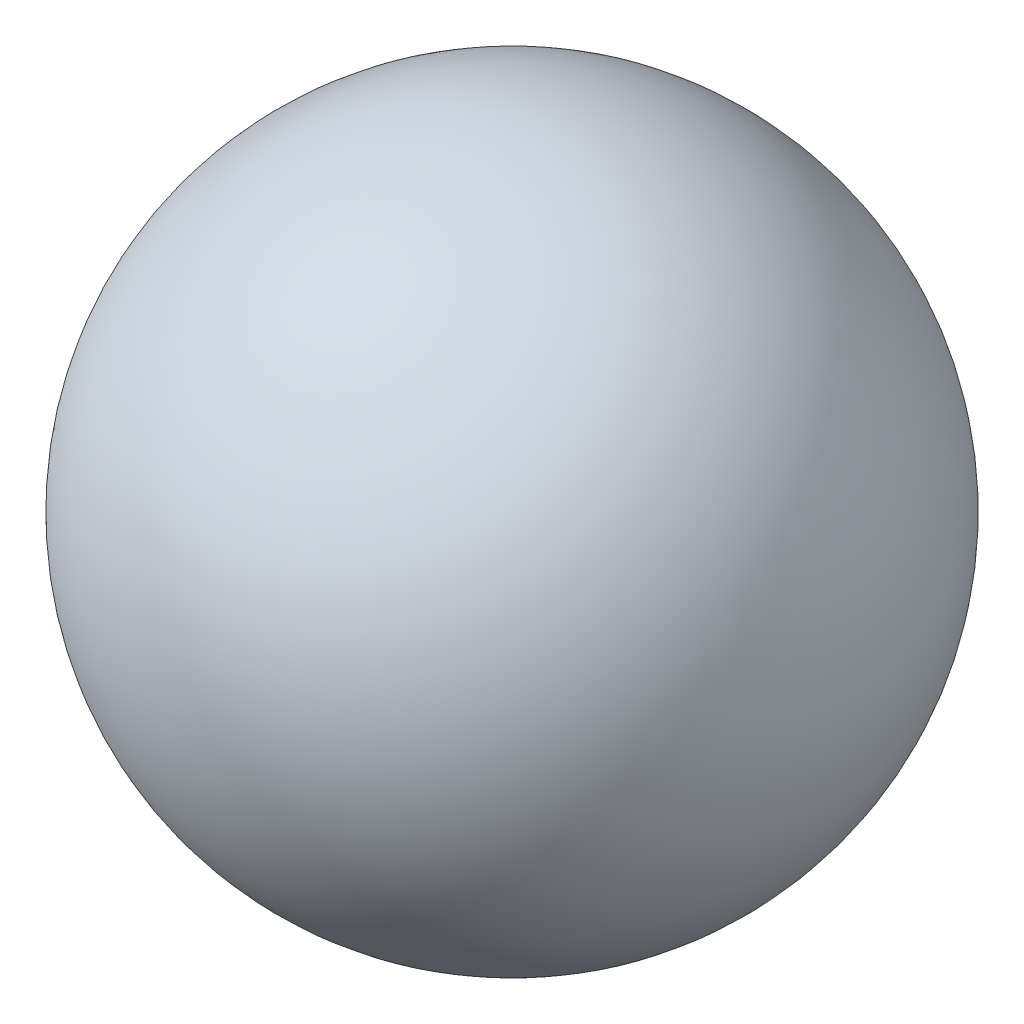
ISO-10303-21;
HEADER;
FILE_DESCRIPTION(('STEP AP214'),'2;1');
FILE_NAME('part.step','',(''),(''),'','','');
FILE_SCHEMA(('AUTOMOTIVE_DESIGN { 1 0 10303 214 1 1 1 1 }'));
ENDSEC;
DATA;
#1=APPLICATION_CONTEXT('core data for automotive mechanical design processes');
#2=APPLICATION_PROTOCOL_DEFINITION('international standard','automotive_design',2000,#1);
#3=PRODUCT_CONTEXT('',#1,'mechanical');
#4=PRODUCT('Part','Part','',(#3));
#5=PRODUCT_RELATED_PRODUCT_CATEGORY('part','',(#4));
#6=PRODUCT_DEFINITION_FORMATION('','',#4);
#7=PRODUCT_DEFINITION_CONTEXT('part definition',#1,'design');
#8=PRODUCT_DEFINITION('design','',#6,#7);
#9=PRODUCT_DEFINITION_SHAPE('','',#8);
#10=(LENGTH_UNIT() NAMED_UNIT(*) SI_UNIT(.MILLI.,.METRE.));
#11=(NAMED_UNIT(*) PLANE_ANGLE_UNIT() SI_UNIT($,.RADIAN.));
#12=(NAMED_UNIT(*) SI_UNIT($,.STERADIAN.) SOLID_ANGLE_UNIT());
#13=UNCERTAINTY_MEASURE_WITH_UNIT(LENGTH_MEASURE(1.E-05),#10,'distance_accuracy_value','');
#14=(GEOMETRIC_REPRESENTATION_CONTEXT(3) GLOBAL_UNCERTAINTY_ASSIGNED_CONTEXT((#13)) GLOBAL_UNIT_ASSIGNED_CONTEXT((#10,
#11,#12)) REPRESENTATION_CONTEXT('',''));
#15=CARTESIAN_POINT('',(0.,0.,0.));
#16=DIRECTION('',(0.,0.,1.));
#17=DIRECTION('',(1.,0.,0.));
#18=AXIS2_PLACEMENT_3D('',#15,#16,#17);
#19=CARTESIAN_POINT('',(0.,-31.5,0.));
#20=DIRECTION('',(0.,1.,0.));
#21=DIRECTION('',(1.,0.,0.));
#22=AXIS2_PLACEMENT_3D('',#19,#20,#21);
#23=SPHERICAL_SURFACE('',#22,31.5);
#24=CARTESIAN_POINT('',(0.,0.,0.));
#25=VERTEX_POINT('',#24);
#26=VERTEX_LOOP('',#25);
#27=FACE_BOUND('',#26,.T.);
#28=ADVANCED_FACE('F32',(#27),#23,.T.);
#29=CLOSED_SHELL('',(#28));
#30=MANIFOLD_SOLID_BREP('B2',#29);
#31=ADVANCED_BREP_SHAPE_REPRESENTATION('',(#18,#30),#14);
#32=SHAPE_DEFINITION_REPRESENTATION(#9,#31);
ENDSEC;
END-ISO-10303-21;
